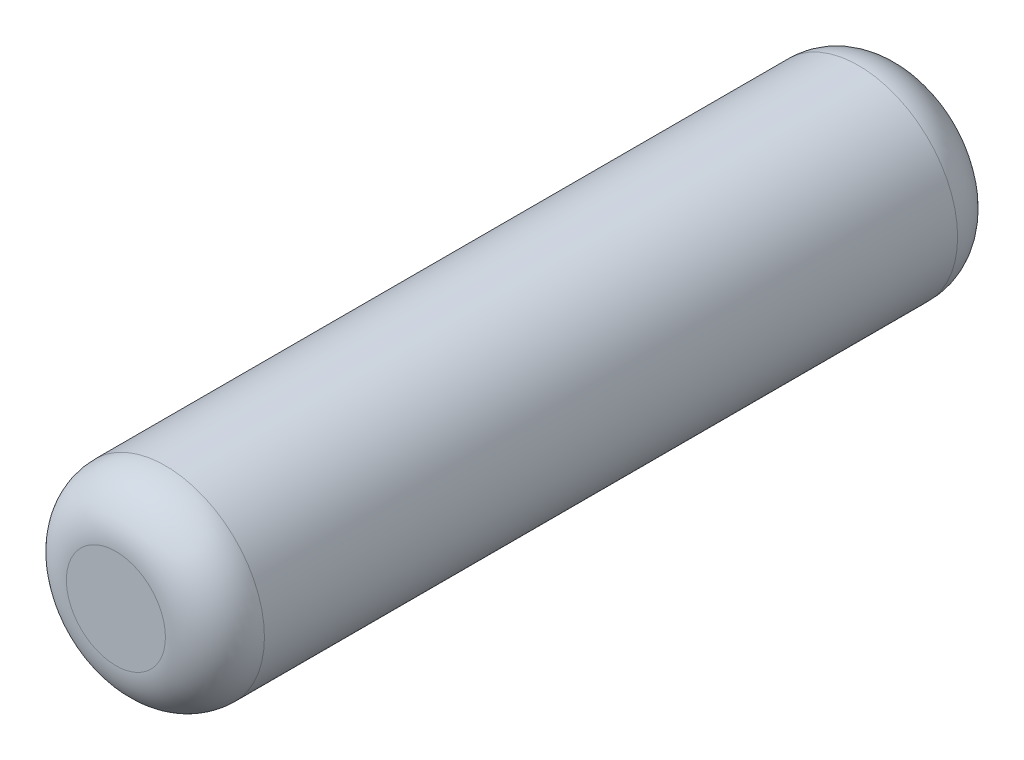
ISO-10303-21;
HEADER;
FILE_DESCRIPTION(('STEP AP214'),'2;1');
FILE_NAME('part.step','',(''),(''),'','','');
FILE_SCHEMA(('AUTOMOTIVE_DESIGN { 1 0 10303 214 1 1 1 1 }'));
ENDSEC;
DATA;
#1=APPLICATION_CONTEXT('core data for automotive mechanical design processes');
#2=APPLICATION_PROTOCOL_DEFINITION('international standard','automotive_design',2000,#1);
#3=PRODUCT_CONTEXT('',#1,'mechanical');
#4=PRODUCT('Part','Part','',(#3));
#5=PRODUCT_RELATED_PRODUCT_CATEGORY('part','',(#4));
#6=PRODUCT_DEFINITION_FORMATION('','',#4);
#7=PRODUCT_DEFINITION_CONTEXT('part definition',#1,'design');
#8=PRODUCT_DEFINITION('design','',#6,#7);
#9=PRODUCT_DEFINITION_SHAPE('','',#8);
#10=(LENGTH_UNIT() NAMED_UNIT(*) SI_UNIT(.MILLI.,.METRE.));
#11=(NAMED_UNIT(*) PLANE_ANGLE_UNIT() SI_UNIT($,.RADIAN.));
#12=(NAMED_UNIT(*) SI_UNIT($,.STERADIAN.) SOLID_ANGLE_UNIT());
#13=UNCERTAINTY_MEASURE_WITH_UNIT(LENGTH_MEASURE(1.E-05),#10,'distance_accuracy_value','');
#14=(GEOMETRIC_REPRESENTATION_CONTEXT(3) GLOBAL_UNCERTAINTY_ASSIGNED_CONTEXT((#13)) GLOBAL_UNIT_ASSIGNED_CONTEXT((#10,
#11,#12)) REPRESENTATION_CONTEXT('',''));
#15=CARTESIAN_POINT('',(0.,0.,0.));
#16=DIRECTION('',(0.,0.,1.));
#17=DIRECTION('',(1.,0.,0.));
#18=AXIS2_PLACEMENT_3D('',#15,#16,#17);
#19=CARTESIAN_POINT('',(0.,0.,200.));
#20=DIRECTION('',(0.,0.,-1.));
#21=DIRECTION('',(-1.,0.,0.));
#22=AXIS2_PLACEMENT_3D('',#19,#20,#21);
#23=CYLINDRICAL_SURFACE('',#22,50.);
#24=CARTESIAN_POINT('',(0.,0.,-175.));
#25=DIRECTION('',(0.,0.,1.));
#26=DIRECTION('',(1.,0.,0.));
#27=AXIS2_PLACEMENT_3D('',#24,#25,#26);
#28=CIRCLE('',#27,50.);
#29=CARTESIAN_POINT('',(50.,0.,-175.));
#30=VERTEX_POINT('',#29);
#31=EDGE_CURVE('E49',#30,#30,#28,.T.);
#32=ORIENTED_EDGE('',*,*,#31,.T.);
#33=EDGE_LOOP('',(#32));
#34=FACE_BOUND('',#33,.T.);
#35=CARTESIAN_POINT('',(0.,0.,175.));
#36=DIRECTION('',(0.,0.,1.));
#37=DIRECTION('',(1.,0.,0.));
#38=AXIS2_PLACEMENT_3D('',#35,#36,#37);
#39=CIRCLE('',#38,50.);
#40=CARTESIAN_POINT('',(50.,0.,175.));
#41=VERTEX_POINT('',#40);
#42=EDGE_CURVE('E54',#41,#41,#39,.F.);
#43=ORIENTED_EDGE('',*,*,#42,.T.);
#44=EDGE_LOOP('',(#43));
#45=FACE_BOUND('',#44,.T.);
#46=ADVANCED_FACE('F36',(#34,#45),#23,.T.);
#47=CARTESIAN_POINT('',(0.,0.,200.));
#48=DIRECTION('',(0.,0.,1.));
#49=DIRECTION('',(1.,0.,0.));
#50=AXIS2_PLACEMENT_3D('',#47,#48,#49);
#51=PLANE('',#50);
#52=CARTESIAN_POINT('',(0.,0.,200.));
#53=DIRECTION('',(0.,0.,1.));
#54=DIRECTION('',(1.,0.,0.));
#55=AXIS2_PLACEMENT_3D('',#52,#53,#54);
#56=CIRCLE('',#55,25.);
#57=CARTESIAN_POINT('',(25.,0.,200.));
#58=VERTEX_POINT('',#57);
#59=EDGE_CURVE('E10',#58,#58,#56,.T.);
#60=ORIENTED_EDGE('',*,*,#59,.T.);
#61=EDGE_LOOP('',(#60));
#62=FACE_BOUND('',#61,.T.);
#63=ADVANCED_FACE('F71',(#62),#51,.T.);
#64=CARTESIAN_POINT('',(0.,0.,-200.));
#65=DIRECTION('',(0.,0.,1.));
#66=DIRECTION('',(1.,0.,0.));
#67=AXIS2_PLACEMENT_3D('',#64,#65,#66);
#68=PLANE('',#67);
#69=CARTESIAN_POINT('',(0.,0.,-200.));
#70=DIRECTION('',(0.,0.,1.));
#71=DIRECTION('',(1.,0.,0.));
#72=AXIS2_PLACEMENT_3D('',#69,#70,#71);
#73=CIRCLE('',#72,25.);
#74=CARTESIAN_POINT('',(25.,0.,-200.));
#75=VERTEX_POINT('',#74);
#76=EDGE_CURVE('E44',#75,#75,#73,.F.);
#77=ORIENTED_EDGE('',*,*,#76,.T.);
#78=EDGE_LOOP('',(#77));
#79=FACE_BOUND('',#78,.T.);
#80=ADVANCED_FACE('F68',(#79),#68,.F.);
#81=CARTESIAN_POINT('',(0.,0.,-175.));
#82=DIRECTION('',(0.,0.,1.));
#83=DIRECTION('',(1.,0.,0.));
#84=AXIS2_PLACEMENT_3D('',#81,#82,#83);
#85=DEGENERATE_TOROIDAL_SURFACE('',#84,25.,25.,.T.);
#86=ORIENTED_EDGE('',*,*,#76,.F.);
#87=EDGE_LOOP('',(#86));
#88=FACE_BOUND('',#87,.T.);
#89=ORIENTED_EDGE('',*,*,#31,.F.);
#90=EDGE_LOOP('',(#89));
#91=FACE_BOUND('',#90,.T.);
#92=ADVANCED_FACE('F64',(#88,#91),#85,.T.);
#93=CARTESIAN_POINT('',(0.,0.,175.));
#94=DIRECTION('',(0.,0.,1.));
#95=DIRECTION('',(1.,0.,0.));
#96=AXIS2_PLACEMENT_3D('',#93,#94,#95);
#97=DEGENERATE_TOROIDAL_SURFACE('',#96,25.,25.,.T.);
#98=ORIENTED_EDGE('',*,*,#42,.F.);
#99=EDGE_LOOP('',(#98));
#100=FACE_BOUND('',#99,.T.);
#101=ORIENTED_EDGE('',*,*,#59,.F.);
#102=EDGE_LOOP('',(#101));
#103=FACE_BOUND('',#102,.T.);
#104=ADVANCED_FACE('F38',(#100,#103),#97,.T.);
#105=CLOSED_SHELL('',(#46,#63,#80,#92,#104));
#106=MANIFOLD_SOLID_BREP('B2',#105);
#107=ADVANCED_BREP_SHAPE_REPRESENTATION('',(#18,#106),#14);
#108=SHAPE_DEFINITION_REPRESENTATION(#9,#107);
ENDSEC;
END-ISO-10303-21;
